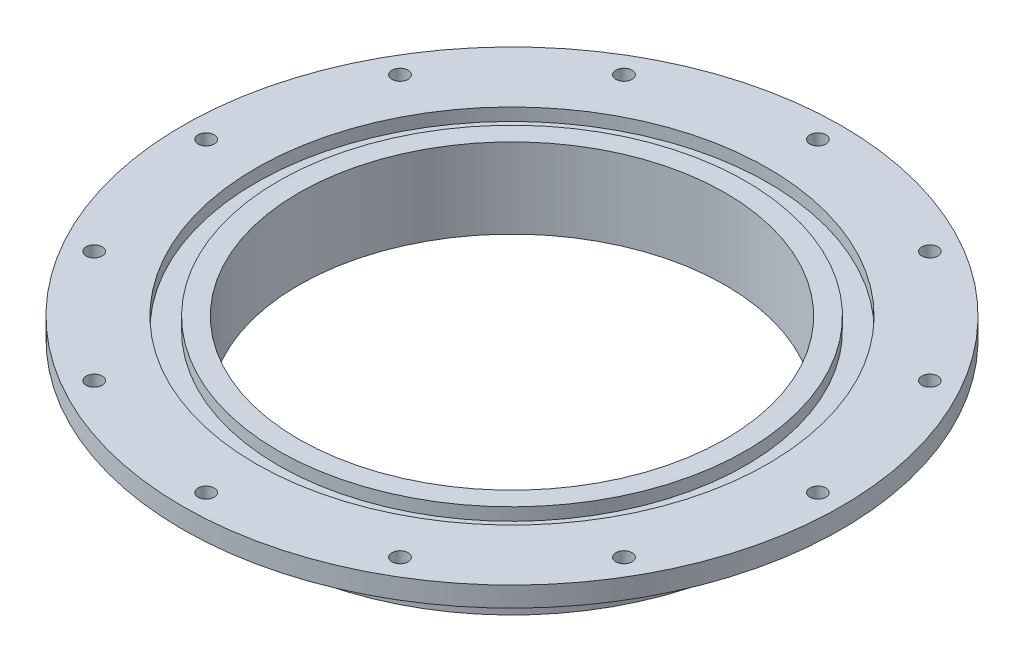
ISO-10303-21;
HEADER;
FILE_DESCRIPTION(('STEP AP214'),'2;1');
FILE_NAME('part.step','',(''),(''),'','','');
FILE_SCHEMA(('AUTOMOTIVE_DESIGN { 1 0 10303 214 1 1 1 1 }'));
ENDSEC;
DATA;
#1=APPLICATION_CONTEXT('core data for automotive mechanical design processes');
#2=APPLICATION_PROTOCOL_DEFINITION('international standard','automotive_design',2000,#1);
#3=PRODUCT_CONTEXT('',#1,'mechanical');
#4=PRODUCT('Part','Part','',(#3));
#5=PRODUCT_RELATED_PRODUCT_CATEGORY('part','',(#4));
#6=PRODUCT_DEFINITION_FORMATION('','',#4);
#7=PRODUCT_DEFINITION_CONTEXT('part definition',#1,'design');
#8=PRODUCT_DEFINITION('design','',#6,#7);
#9=PRODUCT_DEFINITION_SHAPE('','',#8);
#10=(LENGTH_UNIT() NAMED_UNIT(*) SI_UNIT(.MILLI.,.METRE.));
#11=(NAMED_UNIT(*) PLANE_ANGLE_UNIT() SI_UNIT($,.RADIAN.));
#12=(NAMED_UNIT(*) SI_UNIT($,.STERADIAN.) SOLID_ANGLE_UNIT());
#13=UNCERTAINTY_MEASURE_WITH_UNIT(LENGTH_MEASURE(1.E-05),#10,'distance_accuracy_value','');
#14=(GEOMETRIC_REPRESENTATION_CONTEXT(3) GLOBAL_UNCERTAINTY_ASSIGNED_CONTEXT((#13)) GLOBAL_UNIT_ASSIGNED_CONTEXT((#10,
#11,#12)) REPRESENTATION_CONTEXT('',''));
#15=CARTESIAN_POINT('',(0.,0.,0.));
#16=DIRECTION('',(0.,0.,1.));
#17=DIRECTION('',(1.,0.,0.));
#18=AXIS2_PLACEMENT_3D('',#15,#16,#17);
#19=CARTESIAN_POINT('',(0.,25.4,0.));
#20=DIRECTION('',(0.,1.,0.));
#21=DIRECTION('',(0.,0.,1.));
#22=AXIS2_PLACEMENT_3D('',#19,#20,#21);
#23=PLANE('',#22);
#24=CARTESIAN_POINT('',(0.,25.4,0.));
#25=DIRECTION('',(0.,1.,0.));
#26=DIRECTION('',(0.,0.,1.));
#27=AXIS2_PLACEMENT_3D('',#24,#25,#26);
#28=CIRCLE('',#27,67.818);
#29=CARTESIAN_POINT('',(0.,25.4,-67.818));
#30=VERTEX_POINT('',#29);
#31=EDGE_CURVE('E51',#30,#30,#28,.T.);
#32=ORIENTED_EDGE('',*,*,#31,.F.);
#33=EDGE_LOOP('',(#32));
#34=FACE_BOUND('',#33,.T.);
#35=CARTESIAN_POINT('',(0.,25.4,0.));
#36=DIRECTION('',(0.,1.,0.));
#37=DIRECTION('',(0.,0.,1.));
#38=AXIS2_PLACEMENT_3D('',#35,#36,#37);
#39=CIRCLE('',#38,74.295);
#40=CARTESIAN_POINT('',(0.,25.4,74.295));
#41=VERTEX_POINT('',#40);
#42=EDGE_CURVE('E63',#41,#41,#39,.T.);
#43=ORIENTED_EDGE('',*,*,#42,.T.);
#44=EDGE_LOOP('',(#43));
#45=FACE_BOUND('',#44,.T.);
#46=ADVANCED_FACE('F32',(#34,#45),#23,.T.);
#47=CARTESIAN_POINT('',(0.,0.,0.));
#48=DIRECTION('',(0.,1.,0.));
#49=DIRECTION('',(0.,0.,1.));
#50=AXIS2_PLACEMENT_3D('',#47,#48,#49);
#51=PLANE('',#50);
#52=CARTESIAN_POINT('',(0.,0.,0.));
#53=DIRECTION('',(0.,1.,0.));
#54=DIRECTION('',(0.,0.,1.));
#55=AXIS2_PLACEMENT_3D('',#52,#53,#54);
#56=CIRCLE('',#55,80.518);
#57=CARTESIAN_POINT('',(0.,0.,-80.518));
#58=VERTEX_POINT('',#57);
#59=EDGE_CURVE('E36',#58,#58,#56,.T.);
#60=ORIENTED_EDGE('',*,*,#59,.F.);
#61=EDGE_LOOP('',(#60));
#62=FACE_BOUND('',#61,.T.);
#63=CARTESIAN_POINT('',(0.,0.,0.));
#64=DIRECTION('',(0.,1.,0.));
#65=DIRECTION('',(0.,0.,1.));
#66=AXIS2_PLACEMENT_3D('',#63,#64,#65);
#67=CIRCLE('',#66,67.818);
#68=CARTESIAN_POINT('',(0.,0.,-67.818));
#69=VERTEX_POINT('',#68);
#70=EDGE_CURVE('E43',#69,#69,#67,.T.);
#71=ORIENTED_EDGE('',*,*,#70,.T.);
#72=EDGE_LOOP('',(#71));
#73=FACE_BOUND('',#72,.T.);
#74=ADVANCED_FACE('F175',(#62,#73),#51,.F.);
#75=CARTESIAN_POINT('',(0.,19.05,0.));
#76=DIRECTION('',(0.,-1.,0.));
#77=DIRECTION('',(0.,0.,-1.));
#78=AXIS2_PLACEMENT_3D('',#75,#76,#77);
#79=CYLINDRICAL_SURFACE('',#78,80.518);
#80=CARTESIAN_POINT('',(0.,19.05,0.));
#81=DIRECTION('',(0.,1.,0.));
#82=DIRECTION('',(0.,0.,1.));
#83=AXIS2_PLACEMENT_3D('',#80,#81,#82);
#84=CIRCLE('',#83,80.518);
#85=CARTESIAN_POINT('',(0.,19.05,-80.518));
#86=VERTEX_POINT('',#85);
#87=EDGE_CURVE('E10',#86,#86,#84,.T.);
#88=CARTESIAN_POINT('',(0.,19.05,-80.518));
#89=CARTESIAN_POINT('',(0.,18.8515625,-80.518));
#90=CARTESIAN_POINT('',(0.,18.653125,-80.518));
#91=CARTESIAN_POINT('',(0.,18.25625,-80.518));
#92=CARTESIAN_POINT('',(0.,18.0578125,-80.518));
#93=CARTESIAN_POINT('',(0.,17.6609375,-80.518));
#94=CARTESIAN_POINT('',(0.,17.4625,-80.518));
#95=CARTESIAN_POINT('',(0.,17.065625,-80.518));
#96=CARTESIAN_POINT('',(0.,16.8671875,-80.518));
#97=CARTESIAN_POINT('',(0.,16.4703125,-80.518));
#98=CARTESIAN_POINT('',(0.,16.271875,-80.518));
#99=CARTESIAN_POINT('',(0.,15.875,-80.518));
#100=CARTESIAN_POINT('',(0.,15.6765625,-80.518));
#101=CARTESIAN_POINT('',(0.,15.2796875,-80.518));
#102=CARTESIAN_POINT('',(0.,15.08125,-80.518));
#103=CARTESIAN_POINT('',(0.,14.684375,-80.518));
#104=CARTESIAN_POINT('',(0.,14.4859375,-80.518));
#105=CARTESIAN_POINT('',(0.,14.0890625,-80.518));
#106=CARTESIAN_POINT('',(0.,13.890625,-80.518));
#107=CARTESIAN_POINT('',(0.,13.49375,-80.518));
#108=CARTESIAN_POINT('',(0.,13.2953125,-80.518));
#109=CARTESIAN_POINT('',(0.,12.8984375,-80.518));
#110=CARTESIAN_POINT('',(0.,12.7,-80.518));
#111=CARTESIAN_POINT('',(0.,12.303125,-80.518));
#112=CARTESIAN_POINT('',(0.,12.1046875,-80.518));
#113=CARTESIAN_POINT('',(0.,11.7078125,-80.518));
#114=CARTESIAN_POINT('',(0.,11.509375,-80.518));
#115=CARTESIAN_POINT('',(0.,11.1125,-80.518));
#116=CARTESIAN_POINT('',(0.,10.9140625,-80.518));
#117=CARTESIAN_POINT('',(0.,10.5171875,-80.518));
#118=CARTESIAN_POINT('',(0.,10.31875,-80.518));
#119=CARTESIAN_POINT('',(0.,9.921875,-80.518));
#120=CARTESIAN_POINT('',(0.,9.7234375,-80.518));
#121=CARTESIAN_POINT('',(0.,9.3265625,-80.518));
#122=CARTESIAN_POINT('',(0.,9.128125,-80.518));
#123=CARTESIAN_POINT('',(0.,8.73125,-80.518));
#124=CARTESIAN_POINT('',(0.,8.5328125,-80.518));
#125=CARTESIAN_POINT('',(0.,8.1359375,-80.518));
#126=CARTESIAN_POINT('',(0.,7.9375,-80.518));
#127=CARTESIAN_POINT('',(0.,7.540625,-80.518));
#128=CARTESIAN_POINT('',(0.,7.3421875,-80.518));
#129=CARTESIAN_POINT('',(0.,6.9453125,-80.518));
#130=CARTESIAN_POINT('',(0.,6.746875,-80.518));
#131=CARTESIAN_POINT('',(0.,6.35,-80.518));
#132=CARTESIAN_POINT('',(0.,6.1515625,-80.518));
#133=CARTESIAN_POINT('',(0.,5.7546875,-80.518));
#134=CARTESIAN_POINT('',(0.,5.55625,-80.518));
#135=CARTESIAN_POINT('',(0.,5.159375,-80.518));
#136=CARTESIAN_POINT('',(0.,4.9609375,-80.518));
#137=CARTESIAN_POINT('',(0.,4.5640625,-80.518));
#138=CARTESIAN_POINT('',(0.,4.365625,-80.518));
#139=CARTESIAN_POINT('',(0.,3.96875,-80.518));
#140=CARTESIAN_POINT('',(0.,3.7703125,-80.518));
#141=CARTESIAN_POINT('',(0.,3.3734375,-80.518));
#142=CARTESIAN_POINT('',(0.,3.175,-80.518));
#143=CARTESIAN_POINT('',(0.,2.778125,-80.518));
#144=CARTESIAN_POINT('',(0.,2.5796875,-80.518));
#145=CARTESIAN_POINT('',(0.,2.1828125,-80.518));
#146=CARTESIAN_POINT('',(0.,1.984375,-80.518));
#147=CARTESIAN_POINT('',(0.,1.5875,-80.518));
#148=CARTESIAN_POINT('',(0.,1.3890625,-80.518));
#149=CARTESIAN_POINT('',(0.,0.992187500000001,-80.518));
#150=CARTESIAN_POINT('',(0.,0.793750000000001,-80.518));
#151=CARTESIAN_POINT('',(0.,0.396875,-80.518));
#152=CARTESIAN_POINT('',(0.,0.1984375,-80.518));
#153=CARTESIAN_POINT('',(0.,0.,-80.518));
#154=B_SPLINE_CURVE_WITH_KNOTS('',3,(#88,#89,#90,#91,#92,#93,#94,#95,#96,#97,#98,#99,#100,#101,
#102,#103,#104,#105,#106,#107,#108,#109,#110,#111,#112,#113,#114,#115,#116,#117,#118,#119,#120,
#121,#122,#123,#124,#125,#126,#127,#128,#129,#130,#131,#132,#133,#134,#135,#136,#137,#138,#139,
#140,#141,#142,#143,#144,#145,#146,#147,#148,#149,#150,#151,#152,#153),.UNSPECIFIED.,.F.,.F.,(4,
2,2,2,2,2,2,2,2,2,2,2,2,2,2,2,2,2,2,2,2,2,2,2,2,2,2,2,2,2,2,2,4),(0.,0.595312499999997,1.190625,
1.7859375,2.38125,2.9765625,3.571875,4.1671875,4.7625,5.3578125,5.953125,6.5484375,7.14375,
7.7390625,8.334375,8.9296875,9.525,10.1203125,10.715625,11.3109375,11.90625,12.5015625,
13.096875,13.6921875,14.2875,14.8828125,15.478125,16.0734375,16.66875,17.2640625,17.859375,
18.4546875,19.05),.UNSPECIFIED.);
#155=EDGE_CURVE('BSEAM34',#86,#58,#154,.T.);
#156=ORIENTED_EDGE('',*,*,#87,.F.);
#157=ORIENTED_EDGE('',*,*,#59,.T.);
#158=ORIENTED_EDGE('',*,*,#155,.T.);
#159=ORIENTED_EDGE('',*,*,#155,.F.);
#160=EDGE_LOOP('',(#156,#158,#157,#159));
#161=FACE_BOUND('',#160,.T.);
#162=ADVANCED_FACE('F34',(#161),#79,.T.);
#163=CARTESIAN_POINT('',(0.,19.05,0.));
#164=DIRECTION('',(0.,-1.,0.));
#165=DIRECTION('',(0.,0.,-1.));
#166=AXIS2_PLACEMENT_3D('',#163,#164,#165);
#167=CYLINDRICAL_SURFACE('',#166,67.818);
#168=CARTESIAN_POINT('',(0.,0.,-67.818));
#169=CARTESIAN_POINT('',(0.,0.264583333333333,-67.818));
#170=CARTESIAN_POINT('',(0.,0.529166666666666,-67.818));
#171=CARTESIAN_POINT('',(0.,1.05833333333333,-67.818));
#172=CARTESIAN_POINT('',(0.,1.32291666666667,-67.818));
#173=CARTESIAN_POINT('',(0.,1.85208333333333,-67.818));
#174=CARTESIAN_POINT('',(0.,2.11666666666667,-67.818));
#175=CARTESIAN_POINT('',(0.,2.64583333333333,-67.818));
#176=CARTESIAN_POINT('',(0.,2.91041666666667,-67.818));
#177=CARTESIAN_POINT('',(0.,3.43958333333333,-67.818));
#178=CARTESIAN_POINT('',(0.,3.70416666666667,-67.818));
#179=CARTESIAN_POINT('',(0.,4.23333333333333,-67.818));
#180=CARTESIAN_POINT('',(0.,4.49791666666667,-67.818));
#181=CARTESIAN_POINT('',(0.,5.02708333333333,-67.818));
#182=CARTESIAN_POINT('',(0.,5.29166666666666,-67.818));
#183=CARTESIAN_POINT('',(0.,5.82083333333333,-67.818));
#184=CARTESIAN_POINT('',(0.,6.08541666666666,-67.818));
#185=CARTESIAN_POINT('',(0.,6.61458333333333,-67.818));
#186=CARTESIAN_POINT('',(0.,6.87916666666667,-67.818));
#187=CARTESIAN_POINT('',(0.,7.40833333333333,-67.818));
#188=CARTESIAN_POINT('',(0.,7.67291666666667,-67.818));
#189=CARTESIAN_POINT('',(0.,8.20208333333333,-67.818));
#190=CARTESIAN_POINT('',(0.,8.46666666666666,-67.818));
#191=CARTESIAN_POINT('',(0.,8.99583333333333,-67.818));
#192=CARTESIAN_POINT('',(0.,9.26041666666666,-67.818));
#193=CARTESIAN_POINT('',(0.,9.78958333333333,-67.818));
#194=CARTESIAN_POINT('',(0.,10.0541666666667,-67.818));
#195=CARTESIAN_POINT('',(0.,10.5833333333333,-67.818));
#196=CARTESIAN_POINT('',(0.,10.8479166666667,-67.818));
#197=CARTESIAN_POINT('',(0.,11.3770833333333,-67.818));
#198=CARTESIAN_POINT('',(0.,11.6416666666667,-67.818));
#199=CARTESIAN_POINT('',(0.,12.1708333333333,-67.818));
#200=CARTESIAN_POINT('',(0.,12.4354166666667,-67.818));
#201=CARTESIAN_POINT('',(0.,12.9645833333333,-67.818));
#202=CARTESIAN_POINT('',(0.,13.2291666666667,-67.818));
#203=CARTESIAN_POINT('',(0.,13.7583333333333,-67.818));
#204=CARTESIAN_POINT('',(0.,14.0229166666667,-67.818));
#205=CARTESIAN_POINT('',(0.,14.5520833333333,-67.818));
#206=CARTESIAN_POINT('',(0.,14.8166666666667,-67.818));
#207=CARTESIAN_POINT('',(0.,15.3458333333333,-67.818));
#208=CARTESIAN_POINT('',(0.,15.6104166666667,-67.818));
#209=CARTESIAN_POINT('',(0.,16.1395833333333,-67.818));
#210=CARTESIAN_POINT('',(0.,16.4041666666667,-67.818));
#211=CARTESIAN_POINT('',(0.,16.9333333333333,-67.818));
#212=CARTESIAN_POINT('',(0.,17.1979166666667,-67.818));
#213=CARTESIAN_POINT('',(0.,17.7270833333333,-67.818));
#214=CARTESIAN_POINT('',(0.,17.9916666666667,-67.818));
#215=CARTESIAN_POINT('',(0.,18.5208333333333,-67.818));
#216=CARTESIAN_POINT('',(0.,18.7854166666667,-67.818));
#217=CARTESIAN_POINT('',(0.,19.3145833333333,-67.818));
#218=CARTESIAN_POINT('',(0.,19.5791666666667,-67.818));
#219=CARTESIAN_POINT('',(0.,20.1083333333333,-67.818));
#220=CARTESIAN_POINT('',(0.,20.3729166666667,-67.818));
#221=CARTESIAN_POINT('',(0.,20.9020833333333,-67.818));
#222=CARTESIAN_POINT('',(0.,21.1666666666667,-67.818));
#223=CARTESIAN_POINT('',(0.,21.6958333333333,-67.818));
#224=CARTESIAN_POINT('',(0.,21.9604166666667,-67.818));
#225=CARTESIAN_POINT('',(0.,22.4895833333333,-67.818));
#226=CARTESIAN_POINT('',(0.,22.7541666666667,-67.818));
#227=CARTESIAN_POINT('',(0.,23.2833333333333,-67.818));
#228=CARTESIAN_POINT('',(0.,23.5479166666667,-67.818));
#229=CARTESIAN_POINT('',(0.,24.0770833333333,-67.818));
#230=CARTESIAN_POINT('',(0.,24.3416666666667,-67.818));
#231=CARTESIAN_POINT('',(0.,24.8708333333333,-67.818));
#232=CARTESIAN_POINT('',(0.,25.1354166666667,-67.818));
#233=CARTESIAN_POINT('',(0.,25.4,-67.818));
#234=B_SPLINE_CURVE_WITH_KNOTS('',3,(#168,#169,#170,#171,#172,#173,#174,#175,#176,#177,#178,
#179,#180,#181,#182,#183,#184,#185,#186,#187,#188,#189,#190,#191,#192,#193,#194,#195,#196,#197,
#198,#199,#200,#201,#202,#203,#204,#205,#206,#207,#208,#209,#210,#211,#212,#213,#214,#215,#216,
#217,#218,#219,#220,#221,#222,#223,#224,#225,#226,#227,#228,#229,#230,#231,#232,#233),
.UNSPECIFIED.,.F.,.F.,(4,2,2,2,2,2,2,2,2,2,2,2,2,2,2,2,2,2,2,2,2,2,2,2,2,2,2,2,2,2,2,2,4),(0.,
0.793749999999999,1.5875,2.38125,3.175,3.96875,4.7625,5.55625,6.35,7.14375,7.9375,8.73125,9.525,
10.31875,11.1125,11.90625,12.7,13.49375,14.2875,15.08125,15.875,16.66875,17.4625,18.25625,19.05,
19.84375,20.6375,21.43125,22.225,23.01875,23.8125,24.60625,25.4),.UNSPECIFIED.);
#235=EDGE_CURVE('BSEAM147',#69,#30,#234,.T.);
#236=ORIENTED_EDGE('',*,*,#70,.F.);
#237=ORIENTED_EDGE('',*,*,#31,.T.);
#238=ORIENTED_EDGE('',*,*,#235,.T.);
#239=ORIENTED_EDGE('',*,*,#235,.F.);
#240=EDGE_LOOP('',(#236,#238,#237,#239));
#241=FACE_BOUND('',#240,.T.);
#242=ADVANCED_FACE('F147',(#241),#167,.F.);
#243=CARTESIAN_POINT('',(84.2211870243877,25.4,48.6251249999998));
#244=DIRECTION('',(0.,1.,0.));
#245=DIRECTION('',(0.86602540378444,0.,0.499999999999998));
#246=AXIS2_PLACEMENT_3D('',#243,#244,#245);
#247=CIRCLE('',#246,2.55269999999999);
#248=CARTESIAN_POINT('',(86.4318900726283,25.4,49.9014749999998));
#249=VERTEX_POINT('',#248);
#250=EDGE_CURVE('E122',#249,#249,#247,.T.);
#251=ORIENTED_EDGE('',*,*,#250,.F.);
#252=EDGE_LOOP('',(#251));
#253=FACE_BOUND('',#252,.T.);
#254=CARTESIAN_POINT('',(97.25025,25.4,-3.39547433072829E-13));
#255=DIRECTION('',(0.,1.,0.));
#256=DIRECTION('',(1.,0.,0.));
#257=AXIS2_PLACEMENT_3D('',#254,#255,#256);
#258=CIRCLE('',#257,2.55269999999999);
#259=CARTESIAN_POINT('',(99.80295,25.4,-3.48460137486494E-13));
#260=VERTEX_POINT('',#259);
#261=EDGE_CURVE('E116',#260,#260,#258,.T.);
#262=ORIENTED_EDGE('',*,*,#261,.F.);
#263=EDGE_LOOP('',(#262));
#264=FACE_BOUND('',#263,.T.);
#265=CARTESIAN_POINT('',(84.2211870243874,25.4,-48.6251250000004));
#266=DIRECTION('',(0.,1.,0.));
#267=DIRECTION('',(0.866025403784436,0.,-0.500000000000004));
#268=AXIS2_PLACEMENT_3D('',#265,#266,#267);
#269=CIRCLE('',#268,2.55269999999999);
#270=CARTESIAN_POINT('',(86.4318900726279,25.4,-49.9014750000004));
#271=VERTEX_POINT('',#270);
#272=EDGE_CURVE('E110',#271,#271,#269,.T.);
#273=ORIENTED_EDGE('',*,*,#272,.F.);
#274=EDGE_LOOP('',(#273));
#275=FACE_BOUND('',#274,.T.);
#276=CARTESIAN_POINT('',(48.6251249999995,25.4,-84.2211870243879));
#277=DIRECTION('',(0.,1.,0.));
#278=DIRECTION('',(0.499999999999995,0.,-0.866025403784442));
#279=AXIS2_PLACEMENT_3D('',#276,#277,#278);
#280=CIRCLE('',#279,2.55269999999999);
#281=CARTESIAN_POINT('',(49.9014749999995,25.4,-86.4318900726284));
#282=VERTEX_POINT('',#281);
#283=EDGE_CURVE('E104',#282,#282,#280,.T.);
#284=ORIENTED_EDGE('',*,*,#283,.F.);
#285=EDGE_LOOP('',(#284));
#286=FACE_BOUND('',#285,.T.);
#287=CARTESIAN_POINT('',(0.,25.4,-97.25025));
#288=DIRECTION('',(0.,1.,0.));
#289=DIRECTION('',(0.,0.,-1.));
#290=AXIS2_PLACEMENT_3D('',#287,#288,#289);
#291=CIRCLE('',#290,2.55269999999999);
#292=CARTESIAN_POINT('',(0.,25.4,-99.80295));
#293=VERTEX_POINT('',#292);
#294=EDGE_CURVE('E98',#293,#293,#291,.T.);
#295=ORIENTED_EDGE('',*,*,#294,.F.);
#296=EDGE_LOOP('',(#295));
#297=FACE_BOUND('',#296,.T.);
#298=CARTESIAN_POINT('',(-48.6251250000007,25.4,-84.2211870243872));
#299=DIRECTION('',(0.,1.,0.));
#300=DIRECTION('',(-0.500000000000007,0.,-0.866025403784435));
#301=AXIS2_PLACEMENT_3D('',#298,#299,#300);
#302=CIRCLE('',#301,2.55269999999999);
#303=CARTESIAN_POINT('',(-49.9014750000007,25.4,-86.4318900726277));
#304=VERTEX_POINT('',#303);
#305=EDGE_CURVE('E92',#304,#304,#302,.T.);
#306=ORIENTED_EDGE('',*,*,#305,.F.);
#307=EDGE_LOOP('',(#306));
#308=FACE_BOUND('',#307,.T.);
#309=CARTESIAN_POINT('',(-84.2211870243881,25.4,-48.6251249999992));
#310=DIRECTION('',(0.,1.,0.));
#311=DIRECTION('',(-0.866025403784443,0.,-0.499999999999992));
#312=AXIS2_PLACEMENT_3D('',#309,#310,#311);
#313=CIRCLE('',#312,2.55269999999999);
#314=CARTESIAN_POINT('',(-86.4318900726286,25.4,-49.9014749999992));
#315=VERTEX_POINT('',#314);
#316=EDGE_CURVE('E84',#315,#315,#313,.T.);
#317=ORIENTED_EDGE('',*,*,#316,.F.);
#318=EDGE_LOOP('',(#317));
#319=FACE_BOUND('',#318,.T.);
#320=CARTESIAN_POINT('',(-97.25025,25.4,1.01864229921849E-12));
#321=DIRECTION('',(0.,1.,0.));
#322=DIRECTION('',(-1.,0.,0.));
#323=AXIS2_PLACEMENT_3D('',#320,#321,#322);
#324=CIRCLE('',#323,2.55269999999999);
#325=CARTESIAN_POINT('',(-99.80295,25.4,1.04538041245948E-12));
#326=VERTEX_POINT('',#325);
#327=EDGE_CURVE('E85',#326,#326,#324,.T.);
#328=ORIENTED_EDGE('',*,*,#327,.F.);
#329=EDGE_LOOP('',(#328));
#330=FACE_BOUND('',#329,.T.);
#331=CARTESIAN_POINT('',(-84.221187024387,25.4,48.625125000001));
#332=DIRECTION('',(0.,1.,0.));
#333=DIRECTION('',(-0.866025403784433,0.,0.50000000000001));
#334=AXIS2_PLACEMENT_3D('',#331,#332,#333);
#335=CIRCLE('',#334,2.55269999999999);
#336=CARTESIAN_POINT('',(-86.4318900726276,25.4,49.901475000001));
#337=VERTEX_POINT('',#336);
#338=EDGE_CURVE('E132',#337,#337,#335,.T.);
#339=ORIENTED_EDGE('',*,*,#338,.F.);
#340=EDGE_LOOP('',(#339));
#341=FACE_BOUND('',#340,.T.);
#342=CARTESIAN_POINT('',(-48.6251249999989,25.4,84.2211870243882));
#343=DIRECTION('',(0.,1.,0.));
#344=DIRECTION('',(-0.499999999999989,0.,0.866025403784445));
#345=AXIS2_PLACEMENT_3D('',#342,#343,#344);
#346=CIRCLE('',#345,2.55269999999999);
#347=CARTESIAN_POINT('',(-49.9014749999989,25.4,86.4318900726288));
#348=VERTEX_POINT('',#347);
#349=EDGE_CURVE('E133',#348,#348,#346,.T.);
#350=ORIENTED_EDGE('',*,*,#349,.F.);
#351=EDGE_LOOP('',(#350));
#352=FACE_BOUND('',#351,.T.);
#353=CARTESIAN_POINT('',(48.6251250000001,25.4,84.2211870243875));
#354=DIRECTION('',(0.,1.,0.));
#355=DIRECTION('',(0.500000000000001,0.,0.866025403784438));
#356=AXIS2_PLACEMENT_3D('',#353,#354,#355);
#357=CIRCLE('',#356,2.55269999999999);
#358=CARTESIAN_POINT('',(49.9014750000001,25.4,86.4318900726281));
#359=VERTEX_POINT('',#358);
#360=EDGE_CURVE('E77',#359,#359,#357,.T.);
#361=ORIENTED_EDGE('',*,*,#360,.F.);
#362=EDGE_LOOP('',(#361));
#363=FACE_BOUND('',#362,.T.);
#364=CARTESIAN_POINT('',(0.,25.4,97.25025));
#365=DIRECTION('',(0.,1.,0.));
#366=DIRECTION('',(0.,0.,1.));
#367=AXIS2_PLACEMENT_3D('',#364,#365,#366);
#368=CIRCLE('',#367,2.55269999999999);
#369=CARTESIAN_POINT('',(0.,25.4,99.80295));
#370=VERTEX_POINT('',#369);
#371=EDGE_CURVE('E71',#370,#370,#368,.T.);
#372=ORIENTED_EDGE('',*,*,#371,.F.);
#373=EDGE_LOOP('',(#372));
#374=FACE_BOUND('',#373,.T.);
#375=CARTESIAN_POINT('',(0.,25.4,0.));
#376=DIRECTION('',(0.,1.,0.));
#377=DIRECTION('',(0.,0.,1.));
#378=AXIS2_PLACEMENT_3D('',#375,#376,#377);
#379=CIRCLE('',#378,81.407);
#380=CARTESIAN_POINT('',(0.,25.4,81.407));
#381=VERTEX_POINT('',#380);
#382=EDGE_CURVE('E57',#381,#381,#379,.T.);
#383=ORIENTED_EDGE('',*,*,#382,.F.);
#384=EDGE_LOOP('',(#383));
#385=FACE_BOUND('',#384,.T.);
#386=CARTESIAN_POINT('',(0.,25.4,0.));
#387=DIRECTION('',(0.,1.,0.));
#388=DIRECTION('',(0.,0.,1.));
#389=AXIS2_PLACEMENT_3D('',#386,#387,#388);
#390=CIRCLE('',#389,104.775);
#391=CARTESIAN_POINT('',(0.,25.4,104.775));
#392=VERTEX_POINT('',#391);
#393=EDGE_CURVE('E47',#392,#392,#390,.T.);
#394=ORIENTED_EDGE('',*,*,#393,.T.);
#395=EDGE_LOOP('',(#394));
#396=FACE_BOUND('',#395,.T.);
#397=ADVANCED_FACE('F143',(#253,#264,#275,#286,#297,#308,#319,#330,#341,#352,#363,#374,#385,
#396),#23,.T.);
#398=CARTESIAN_POINT('',(0.,19.05,0.));
#399=DIRECTION('',(0.,1.,0.));
#400=DIRECTION('',(0.,0.,1.));
#401=AXIS2_PLACEMENT_3D('',#398,#399,#400);
#402=PLANE('',#401);
#403=CARTESIAN_POINT('',(84.2211870243877,19.05,48.6251249999998));
#404=DIRECTION('',(0.,1.,0.));
#405=DIRECTION('',(0.,0.,1.));
#406=AXIS2_PLACEMENT_3D('',#403,#404,#405);
#407=CIRCLE('',#406,2.55269999999999);
#408=CARTESIAN_POINT('',(84.2211870243877,19.05,51.1778249999998));
#409=VERTEX_POINT('',#408);
#410=EDGE_CURVE('E80',#409,#409,#407,.F.);
#411=ORIENTED_EDGE('',*,*,#410,.F.);
#412=EDGE_LOOP('',(#411));
#413=FACE_BOUND('',#412,.T.);
#414=CARTESIAN_POINT('',(97.25025,19.05,-3.39547433072829E-13));
#415=DIRECTION('',(0.,1.,0.));
#416=DIRECTION('',(0.,0.,1.));
#417=AXIS2_PLACEMENT_3D('',#414,#415,#416);
#418=CIRCLE('',#417,2.55269999999999);
#419=CARTESIAN_POINT('',(97.25025,19.05,2.55269999999965));
#420=VERTEX_POINT('',#419);
#421=EDGE_CURVE('E119',#420,#420,#418,.F.);
#422=ORIENTED_EDGE('',*,*,#421,.F.);
#423=EDGE_LOOP('',(#422));
#424=FACE_BOUND('',#423,.T.);
#425=CARTESIAN_POINT('',(84.2211870243874,19.05,-48.6251250000004));
#426=DIRECTION('',(0.,1.,0.));
#427=DIRECTION('',(0.,0.,1.));
#428=AXIS2_PLACEMENT_3D('',#425,#426,#427);
#429=CIRCLE('',#428,2.55269999999999);
#430=CARTESIAN_POINT('',(84.2211870243874,19.05,-46.0724250000004));
#431=VERTEX_POINT('',#430);
#432=EDGE_CURVE('E113',#431,#431,#429,.F.);
#433=ORIENTED_EDGE('',*,*,#432,.F.);
#434=EDGE_LOOP('',(#433));
#435=FACE_BOUND('',#434,.T.);
#436=CARTESIAN_POINT('',(48.6251249999995,19.05,-84.2211870243879));
#437=DIRECTION('',(0.,1.,0.));
#438=DIRECTION('',(0.,0.,1.));
#439=AXIS2_PLACEMENT_3D('',#436,#437,#438);
#440=CIRCLE('',#439,2.55269999999999);
#441=CARTESIAN_POINT('',(48.6251249999995,19.05,-81.6684870243879));
#442=VERTEX_POINT('',#441);
#443=EDGE_CURVE('E107',#442,#442,#440,.F.);
#444=ORIENTED_EDGE('',*,*,#443,.F.);
#445=EDGE_LOOP('',(#444));
#446=FACE_BOUND('',#445,.T.);
#447=CARTESIAN_POINT('',(0.,19.05,-97.25025));
#448=DIRECTION('',(0.,1.,0.));
#449=DIRECTION('',(0.,0.,1.));
#450=AXIS2_PLACEMENT_3D('',#447,#448,#449);
#451=CIRCLE('',#450,2.55269999999999);
#452=CARTESIAN_POINT('',(0.,19.05,-94.69755));
#453=VERTEX_POINT('',#452);
#454=EDGE_CURVE('E101',#453,#453,#451,.F.);
#455=ORIENTED_EDGE('',*,*,#454,.F.);
#456=EDGE_LOOP('',(#455));
#457=FACE_BOUND('',#456,.T.);
#458=CARTESIAN_POINT('',(-48.6251250000007,19.05,-84.2211870243872));
#459=DIRECTION('',(0.,1.,0.));
#460=DIRECTION('',(0.,0.,1.));
#461=AXIS2_PLACEMENT_3D('',#458,#459,#460);
#462=CIRCLE('',#461,2.55269999999999);
#463=CARTESIAN_POINT('',(-48.6251250000007,19.05,-81.6684870243872));
#464=VERTEX_POINT('',#463);
#465=EDGE_CURVE('E95',#464,#464,#462,.F.);
#466=ORIENTED_EDGE('',*,*,#465,.F.);
#467=EDGE_LOOP('',(#466));
#468=FACE_BOUND('',#467,.T.);
#469=CARTESIAN_POINT('',(-84.2211870243881,19.05,-48.6251249999992));
#470=DIRECTION('',(0.,1.,0.));
#471=DIRECTION('',(0.,0.,1.));
#472=AXIS2_PLACEMENT_3D('',#469,#470,#471);
#473=CIRCLE('',#472,2.55269999999999);
#474=CARTESIAN_POINT('',(-84.2211870243881,19.05,-46.0724249999992));
#475=VERTEX_POINT('',#474);
#476=EDGE_CURVE('E89',#475,#475,#473,.F.);
#477=ORIENTED_EDGE('',*,*,#476,.F.);
#478=EDGE_LOOP('',(#477));
#479=FACE_BOUND('',#478,.T.);
#480=CARTESIAN_POINT('',(-97.25025,19.05,1.01864229921849E-12));
#481=DIRECTION('',(0.,1.,0.));
#482=DIRECTION('',(0.,0.,1.));
#483=AXIS2_PLACEMENT_3D('',#480,#481,#482);
#484=CIRCLE('',#483,2.55269999999999);
#485=CARTESIAN_POINT('',(-97.25025,19.05,2.55270000000101));
#486=VERTEX_POINT('',#485);
#487=EDGE_CURVE('E81',#486,#486,#484,.F.);
#488=ORIENTED_EDGE('',*,*,#487,.F.);
#489=EDGE_LOOP('',(#488));
#490=FACE_BOUND('',#489,.T.);
#491=CARTESIAN_POINT('',(-84.221187024387,19.05,48.625125000001));
#492=DIRECTION('',(0.,1.,0.));
#493=DIRECTION('',(0.,0.,1.));
#494=AXIS2_PLACEMENT_3D('',#491,#492,#493);
#495=CIRCLE('',#494,2.55269999999999);
#496=CARTESIAN_POINT('',(-84.221187024387,19.05,51.177825000001));
#497=VERTEX_POINT('',#496);
#498=EDGE_CURVE('E88',#497,#497,#495,.F.);
#499=ORIENTED_EDGE('',*,*,#498,.F.);
#500=EDGE_LOOP('',(#499));
#501=FACE_BOUND('',#500,.T.);
#502=CARTESIAN_POINT('',(-48.6251249999989,19.05,84.2211870243882));
#503=DIRECTION('',(0.,1.,0.));
#504=DIRECTION('',(0.,0.,1.));
#505=AXIS2_PLACEMENT_3D('',#502,#503,#504);
#506=CIRCLE('',#505,2.55269999999999);
#507=CARTESIAN_POINT('',(-48.6251249999989,19.05,86.7738870243882));
#508=VERTEX_POINT('',#507);
#509=EDGE_CURVE('E129',#508,#508,#506,.F.);
#510=ORIENTED_EDGE('',*,*,#509,.F.);
#511=EDGE_LOOP('',(#510));
#512=FACE_BOUND('',#511,.T.);
#513=CARTESIAN_POINT('',(48.6251250000001,19.05,84.2211870243875));
#514=DIRECTION('',(0.,1.,0.));
#515=DIRECTION('',(0.,0.,1.));
#516=AXIS2_PLACEMENT_3D('',#513,#514,#515);
#517=CIRCLE('',#516,2.55269999999999);
#518=CARTESIAN_POINT('',(48.6251250000001,19.05,86.7738870243875));
#519=VERTEX_POINT('',#518);
#520=EDGE_CURVE('E74',#519,#519,#517,.F.);
#521=ORIENTED_EDGE('',*,*,#520,.F.);
#522=EDGE_LOOP('',(#521));
#523=FACE_BOUND('',#522,.T.);
#524=CARTESIAN_POINT('',(0.,19.05,97.25025));
#525=DIRECTION('',(0.,1.,0.));
#526=DIRECTION('',(0.,0.,1.));
#527=AXIS2_PLACEMENT_3D('',#524,#525,#526);
#528=CIRCLE('',#527,2.55269999999999);
#529=CARTESIAN_POINT('',(0.,19.05,99.80295));
#530=VERTEX_POINT('',#529);
#531=EDGE_CURVE('E66',#530,#530,#528,.F.);
#532=ORIENTED_EDGE('',*,*,#531,.F.);
#533=EDGE_LOOP('',(#532));
#534=FACE_BOUND('',#533,.T.);
#535=ORIENTED_EDGE('',*,*,#87,.T.);
#536=EDGE_LOOP('',(#535));
#537=FACE_BOUND('',#536,.T.);
#538=CARTESIAN_POINT('',(0.,19.05,0.));
#539=DIRECTION('',(0.,1.,0.));
#540=DIRECTION('',(0.,0.,1.));
#541=AXIS2_PLACEMENT_3D('',#538,#539,#540);
#542=CIRCLE('',#541,104.775);
#543=CARTESIAN_POINT('',(0.,19.05,104.775));
#544=VERTEX_POINT('',#543);
#545=EDGE_CURVE('E48',#544,#544,#542,.T.);
#546=ORIENTED_EDGE('',*,*,#545,.F.);
#547=EDGE_LOOP('',(#546));
#548=FACE_BOUND('',#547,.T.);
#549=ADVANCED_FACE('F146',(#413,#424,#435,#446,#457,#468,#479,#490,#501,#512,#523,#534,#537,
#548),#402,.F.);
#550=CARTESIAN_POINT('',(0.,25.4,0.));
#551=DIRECTION('',(0.,-1.,0.));
#552=DIRECTION('',(0.,0.,-1.));
#553=AXIS2_PLACEMENT_3D('',#550,#551,#552);
#554=CYLINDRICAL_SURFACE('',#553,104.775);
#555=ORIENTED_EDGE('',*,*,#393,.F.);
#556=EDGE_LOOP('',(#555));
#557=FACE_BOUND('',#556,.T.);
#558=ORIENTED_EDGE('',*,*,#545,.T.);
#559=EDGE_LOOP('',(#558));
#560=FACE_BOUND('',#559,.T.);
#561=ADVANCED_FACE('F160',(#557,#560),#554,.T.);
#562=CARTESIAN_POINT('',(0.,21.4122,0.));
#563=DIRECTION('',(0.,1.,0.));
#564=DIRECTION('',(0.,0.,1.));
#565=AXIS2_PLACEMENT_3D('',#562,#563,#564);
#566=CYLINDRICAL_SURFACE('',#565,81.407);
#567=CARTESIAN_POINT('',(0.,21.4122,0.));
#568=DIRECTION('',(0.,1.,0.));
#569=DIRECTION('',(0.,0.,1.));
#570=AXIS2_PLACEMENT_3D('',#567,#568,#569);
#571=CIRCLE('',#570,81.407);
#572=CARTESIAN_POINT('',(0.,21.4122,81.407));
#573=VERTEX_POINT('',#572);
#574=EDGE_CURVE('E56',#573,#573,#571,.T.);
#575=ORIENTED_EDGE('',*,*,#574,.F.);
#576=EDGE_LOOP('',(#575));
#577=FACE_BOUND('',#576,.T.);
#578=ORIENTED_EDGE('',*,*,#382,.T.);
#579=EDGE_LOOP('',(#578));
#580=FACE_BOUND('',#579,.T.);
#581=ADVANCED_FACE('F163',(#577,#580),#566,.F.);
#582=CARTESIAN_POINT('',(0.,21.4122,0.));
#583=DIRECTION('',(0.,1.,0.));
#584=DIRECTION('',(0.,0.,1.));
#585=AXIS2_PLACEMENT_3D('',#582,#583,#584);
#586=PLANE('',#585);
#587=CARTESIAN_POINT('',(0.,21.4122,0.));
#588=DIRECTION('',(0.,1.,0.));
#589=DIRECTION('',(0.,0.,1.));
#590=AXIS2_PLACEMENT_3D('',#587,#588,#589);
#591=CIRCLE('',#590,74.295);
#592=CARTESIAN_POINT('',(0.,21.4122,74.295));
#593=VERTEX_POINT('',#592);
#594=EDGE_CURVE('E60',#593,#593,#591,.T.);
#595=ORIENTED_EDGE('',*,*,#594,.F.);
#596=EDGE_LOOP('',(#595));
#597=FACE_BOUND('',#596,.T.);
#598=ORIENTED_EDGE('',*,*,#574,.T.);
#599=EDGE_LOOP('',(#598));
#600=FACE_BOUND('',#599,.T.);
#601=ADVANCED_FACE('F186',(#597,#600),#586,.T.);
#602=CARTESIAN_POINT('',(0.,21.4122,0.));
#603=DIRECTION('',(0.,1.,0.));
#604=DIRECTION('',(0.,0.,1.));
#605=AXIS2_PLACEMENT_3D('',#602,#603,#604);
#606=CYLINDRICAL_SURFACE('',#605,74.295);
#607=ORIENTED_EDGE('',*,*,#594,.T.);
#608=EDGE_LOOP('',(#607));
#609=FACE_BOUND('',#608,.T.);
#610=ORIENTED_EDGE('',*,*,#42,.F.);
#611=EDGE_LOOP('',(#610));
#612=FACE_BOUND('',#611,.T.);
#613=ADVANCED_FACE('F190',(#609,#612),#606,.T.);
#614=CARTESIAN_POINT('',(0.,11.8298740786604,97.25025));
#615=DIRECTION('',(0.,1.,0.));
#616=DIRECTION('',(0.,0.,1.));
#617=AXIS2_PLACEMENT_3D('',#614,#615,#616);
#618=CYLINDRICAL_SURFACE('',#617,2.55269999999999);
#619=ORIENTED_EDGE('',*,*,#531,.T.);
#620=EDGE_LOOP('',(#619));
#621=FACE_BOUND('',#620,.T.);
#622=ORIENTED_EDGE('',*,*,#371,.T.);
#623=EDGE_LOOP('',(#622));
#624=FACE_BOUND('',#623,.T.);
#625=ADVANCED_FACE('F194',(#621,#624),#618,.F.);
#626=CARTESIAN_POINT('',(48.6251250000001,11.8298740786604,84.2211870243875));
#627=DIRECTION('',(0.,1.,0.));
#628=DIRECTION('',(0.,0.,1.));
#629=AXIS2_PLACEMENT_3D('',#626,#627,#628);
#630=CYLINDRICAL_SURFACE('',#629,2.55269999999999);
#631=ORIENTED_EDGE('',*,*,#520,.T.);
#632=EDGE_LOOP('',(#631));
#633=FACE_BOUND('',#632,.T.);
#634=ORIENTED_EDGE('',*,*,#360,.T.);
#635=EDGE_LOOP('',(#634));
#636=FACE_BOUND('',#635,.T.);
#637=ADVANCED_FACE('F198',(#633,#636),#630,.F.);
#638=CARTESIAN_POINT('',(-48.6251249999989,11.8298740786604,84.2211870243882));
#639=DIRECTION('',(0.,1.,0.));
#640=DIRECTION('',(0.,0.,1.));
#641=AXIS2_PLACEMENT_3D('',#638,#639,#640);
#642=CYLINDRICAL_SURFACE('',#641,2.55269999999999);
#643=ORIENTED_EDGE('',*,*,#509,.T.);
#644=EDGE_LOOP('',(#643));
#645=FACE_BOUND('',#644,.T.);
#646=ORIENTED_EDGE('',*,*,#349,.T.);
#647=EDGE_LOOP('',(#646));
#648=FACE_BOUND('',#647,.T.);
#649=ADVANCED_FACE('F202',(#645,#648),#642,.F.);
#650=CARTESIAN_POINT('',(-84.221187024387,11.8298740786604,48.625125000001));
#651=DIRECTION('',(0.,1.,0.));
#652=DIRECTION('',(0.,0.,1.));
#653=AXIS2_PLACEMENT_3D('',#650,#651,#652);
#654=CYLINDRICAL_SURFACE('',#653,2.55269999999999);
#655=ORIENTED_EDGE('',*,*,#498,.T.);
#656=EDGE_LOOP('',(#655));
#657=FACE_BOUND('',#656,.T.);
#658=ORIENTED_EDGE('',*,*,#338,.T.);
#659=EDGE_LOOP('',(#658));
#660=FACE_BOUND('',#659,.T.);
#661=ADVANCED_FACE('F141',(#657,#660),#654,.F.);
#662=CARTESIAN_POINT('',(-97.25025,11.8298740786604,1.01864229921849E-12));
#663=DIRECTION('',(0.,1.,0.));
#664=DIRECTION('',(0.,0.,1.));
#665=AXIS2_PLACEMENT_3D('',#662,#663,#664);
#666=CYLINDRICAL_SURFACE('',#665,2.55269999999999);
#667=ORIENTED_EDGE('',*,*,#487,.T.);
#668=EDGE_LOOP('',(#667));
#669=FACE_BOUND('',#668,.T.);
#670=ORIENTED_EDGE('',*,*,#327,.T.);
#671=EDGE_LOOP('',(#670));
#672=FACE_BOUND('',#671,.T.);
#673=ADVANCED_FACE('F204',(#669,#672),#666,.F.);
#674=CARTESIAN_POINT('',(-84.2211870243881,11.8298740786604,-48.6251249999992));
#675=DIRECTION('',(0.,1.,0.));
#676=DIRECTION('',(0.,0.,1.));
#677=AXIS2_PLACEMENT_3D('',#674,#675,#676);
#678=CYLINDRICAL_SURFACE('',#677,2.55269999999999);
#679=ORIENTED_EDGE('',*,*,#476,.T.);
#680=EDGE_LOOP('',(#679));
#681=FACE_BOUND('',#680,.T.);
#682=ORIENTED_EDGE('',*,*,#316,.T.);
#683=EDGE_LOOP('',(#682));
#684=FACE_BOUND('',#683,.T.);
#685=ADVANCED_FACE('F207',(#681,#684),#678,.F.);
#686=CARTESIAN_POINT('',(-48.6251250000007,11.8298740786604,-84.2211870243872));
#687=DIRECTION('',(0.,1.,0.));
#688=DIRECTION('',(0.,0.,1.));
#689=AXIS2_PLACEMENT_3D('',#686,#687,#688);
#690=CYLINDRICAL_SURFACE('',#689,2.55269999999999);
#691=ORIENTED_EDGE('',*,*,#465,.T.);
#692=EDGE_LOOP('',(#691));
#693=FACE_BOUND('',#692,.T.);
#694=ORIENTED_EDGE('',*,*,#305,.T.);
#695=EDGE_LOOP('',(#694));
#696=FACE_BOUND('',#695,.T.);
#697=ADVANCED_FACE('F211',(#693,#696),#690,.F.);
#698=CARTESIAN_POINT('',(0.,11.8298740786604,-97.25025));
#699=DIRECTION('',(0.,1.,0.));
#700=DIRECTION('',(0.,0.,1.));
#701=AXIS2_PLACEMENT_3D('',#698,#699,#700);
#702=CYLINDRICAL_SURFACE('',#701,2.55269999999999);
#703=ORIENTED_EDGE('',*,*,#454,.T.);
#704=EDGE_LOOP('',(#703));
#705=FACE_BOUND('',#704,.T.);
#706=ORIENTED_EDGE('',*,*,#294,.T.);
#707=EDGE_LOOP('',(#706));
#708=FACE_BOUND('',#707,.T.);
#709=ADVANCED_FACE('F215',(#705,#708),#702,.F.);
#710=CARTESIAN_POINT('',(48.6251249999995,11.8298740786604,-84.2211870243879));
#711=DIRECTION('',(0.,1.,0.));
#712=DIRECTION('',(0.,0.,1.));
#713=AXIS2_PLACEMENT_3D('',#710,#711,#712);
#714=CYLINDRICAL_SURFACE('',#713,2.55269999999999);
#715=ORIENTED_EDGE('',*,*,#443,.T.);
#716=EDGE_LOOP('',(#715));
#717=FACE_BOUND('',#716,.T.);
#718=ORIENTED_EDGE('',*,*,#283,.T.);
#719=EDGE_LOOP('',(#718));
#720=FACE_BOUND('',#719,.T.);
#721=ADVANCED_FACE('F219',(#717,#720),#714,.F.);
#722=CARTESIAN_POINT('',(84.2211870243874,11.8298740786604,-48.6251250000004));
#723=DIRECTION('',(0.,1.,0.));
#724=DIRECTION('',(0.,0.,1.));
#725=AXIS2_PLACEMENT_3D('',#722,#723,#724);
#726=CYLINDRICAL_SURFACE('',#725,2.55269999999999);
#727=ORIENTED_EDGE('',*,*,#432,.T.);
#728=EDGE_LOOP('',(#727));
#729=FACE_BOUND('',#728,.T.);
#730=ORIENTED_EDGE('',*,*,#272,.T.);
#731=EDGE_LOOP('',(#730));
#732=FACE_BOUND('',#731,.T.);
#733=ADVANCED_FACE('F223',(#729,#732),#726,.F.);
#734=CARTESIAN_POINT('',(97.25025,11.8298740786604,-3.39547433072829E-13));
#735=DIRECTION('',(0.,1.,0.));
#736=DIRECTION('',(0.,0.,1.));
#737=AXIS2_PLACEMENT_3D('',#734,#735,#736);
#738=CYLINDRICAL_SURFACE('',#737,2.55269999999999);
#739=ORIENTED_EDGE('',*,*,#421,.T.);
#740=EDGE_LOOP('',(#739));
#741=FACE_BOUND('',#740,.T.);
#742=ORIENTED_EDGE('',*,*,#261,.T.);
#743=EDGE_LOOP('',(#742));
#744=FACE_BOUND('',#743,.T.);
#745=ADVANCED_FACE('F227',(#741,#744),#738,.F.);
#746=CARTESIAN_POINT('',(84.2211870243877,11.8298740786604,48.6251249999998));
#747=DIRECTION('',(0.,1.,0.));
#748=DIRECTION('',(0.,0.,1.));
#749=AXIS2_PLACEMENT_3D('',#746,#747,#748);
#750=CYLINDRICAL_SURFACE('',#749,2.55269999999999);
#751=ORIENTED_EDGE('',*,*,#410,.T.);
#752=EDGE_LOOP('',(#751));
#753=FACE_BOUND('',#752,.T.);
#754=ORIENTED_EDGE('',*,*,#250,.T.);
#755=EDGE_LOOP('',(#754));
#756=FACE_BOUND('',#755,.T.);
#757=ADVANCED_FACE('F231',(#753,#756),#750,.F.);
#758=CLOSED_SHELL('',(#46,#74,#162,#242,#397,#549,#561,#581,#601,#613,#625,#637,#649,#661,#673,
#685,#697,#709,#721,#733,#745,#757));
#759=MANIFOLD_SOLID_BREP('B2',#758);
#760=ADVANCED_BREP_SHAPE_REPRESENTATION('',(#18,#759),#14);
#761=SHAPE_DEFINITION_REPRESENTATION(#9,#760);
ENDSEC;
END-ISO-10303-21;
